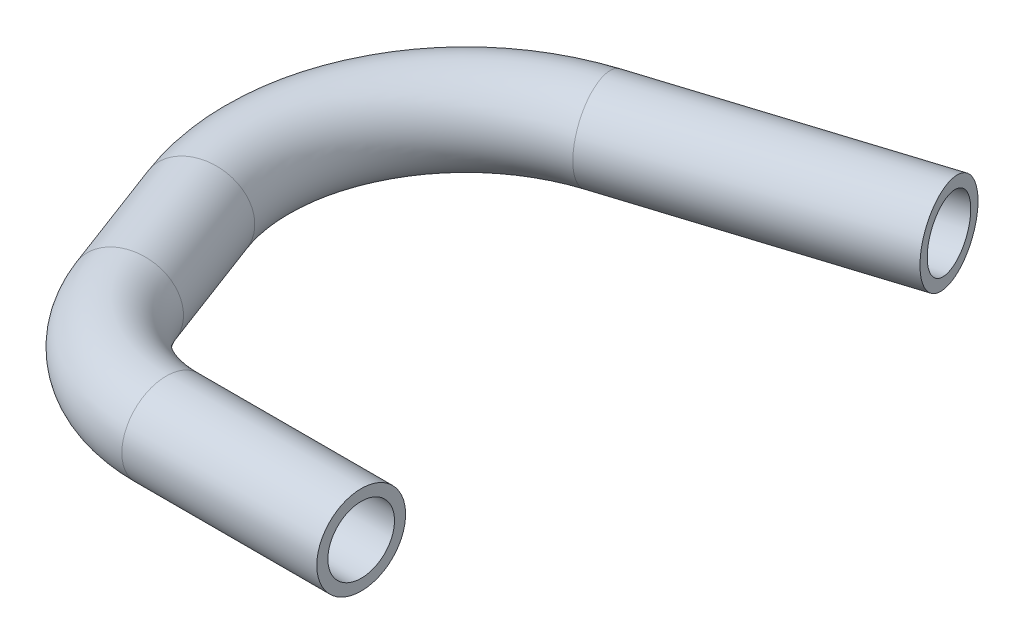
ISO-10303-21;
HEADER;
FILE_DESCRIPTION(('STEP AP214'),'2;1');
FILE_NAME('part.step','',(''),(''),'','','');
FILE_SCHEMA(('AUTOMOTIVE_DESIGN { 1 0 10303 214 1 1 1 1 }'));
ENDSEC;
DATA;
#1=APPLICATION_CONTEXT('core data for automotive mechanical design processes');
#2=APPLICATION_PROTOCOL_DEFINITION('international standard','automotive_design',2000,#1);
#3=PRODUCT_CONTEXT('',#1,'mechanical');
#4=PRODUCT('Part','Part','',(#3));
#5=PRODUCT_RELATED_PRODUCT_CATEGORY('part','',(#4));
#6=PRODUCT_DEFINITION_FORMATION('','',#4);
#7=PRODUCT_DEFINITION_CONTEXT('part definition',#1,'design');
#8=PRODUCT_DEFINITION('design','',#6,#7);
#9=PRODUCT_DEFINITION_SHAPE('','',#8);
#10=(LENGTH_UNIT() NAMED_UNIT(*) SI_UNIT(.MILLI.,.METRE.));
#11=(NAMED_UNIT(*) PLANE_ANGLE_UNIT() SI_UNIT($,.RADIAN.));
#12=(NAMED_UNIT(*) SI_UNIT($,.STERADIAN.) SOLID_ANGLE_UNIT());
#13=UNCERTAINTY_MEASURE_WITH_UNIT(LENGTH_MEASURE(1.E-05),#10,'distance_accuracy_value','');
#14=(GEOMETRIC_REPRESENTATION_CONTEXT(3) GLOBAL_UNCERTAINTY_ASSIGNED_CONTEXT((#13)) GLOBAL_UNIT_ASSIGNED_CONTEXT((#10,
#11,#12)) REPRESENTATION_CONTEXT('',''));
#15=CARTESIAN_POINT('',(0.,0.,0.));
#16=DIRECTION('',(0.,0.,1.));
#17=DIRECTION('',(1.,0.,0.));
#18=AXIS2_PLACEMENT_3D('',#15,#16,#17);
#19=CARTESIAN_POINT('',(0.,0.,0.));
#20=DIRECTION('',(-0.999999999999999,0.,0.));
#21=DIRECTION('',(0.,0.,1.));
#22=AXIS2_PLACEMENT_3D('',#19,#20,#21);
#23=CYLINDRICAL_SURFACE('',#22,16.);
#24=CARTESIAN_POINT('',(-70.1970105,0.,0.));
#25=DIRECTION('',(0.999999999999999,0.,0.));
#26=DIRECTION('',(0.,0.,-1.));
#27=AXIS2_PLACEMENT_3D('',#24,#25,#26);
#28=CIRCLE('',#27,16.);
#29=CARTESIAN_POINT('',(-70.1970105,0.,16.));
#30=VERTEX_POINT('',#29);
#31=EDGE_CURVE('E64',#30,#30,#28,.T.);
#32=CARTESIAN_POINT('',(0.,0.,0.));
#33=DIRECTION('',(0.999999999999999,0.,0.));
#34=DIRECTION('',(0.,0.,-1.));
#35=AXIS2_PLACEMENT_3D('',#32,#33,#34);
#36=CIRCLE('',#35,16.);
#37=CARTESIAN_POINT('',(0.,0.,16.));
#38=VERTEX_POINT('',#37);
#39=EDGE_CURVE('E61',#38,#38,#36,.T.);
#40=CARTESIAN_POINT('',(-70.1970105,0.,16.));
#41=CARTESIAN_POINT('',(-69.465791640625,0.,16.));
#42=CARTESIAN_POINT('',(-68.73457278125,0.,16.));
#43=CARTESIAN_POINT('',(-67.2721350625,0.,16.));
#44=CARTESIAN_POINT('',(-66.540916203125,0.,16.));
#45=CARTESIAN_POINT('',(-65.078478484375,0.,16.));
#46=CARTESIAN_POINT('',(-64.347259625,0.,16.));
#47=CARTESIAN_POINT('',(-62.88482190625,0.,16.));
#48=CARTESIAN_POINT('',(-62.153603046875,0.,16.));
#49=CARTESIAN_POINT('',(-60.691165328125,0.,16.));
#50=CARTESIAN_POINT('',(-59.95994646875,0.,16.));
#51=CARTESIAN_POINT('',(-58.49750875,0.,16.));
#52=CARTESIAN_POINT('',(-57.766289890625,0.,16.));
#53=CARTESIAN_POINT('',(-56.303852171875,0.,16.));
#54=CARTESIAN_POINT('',(-55.5726333125,0.,16.));
#55=CARTESIAN_POINT('',(-54.11019559375,0.,16.));
#56=CARTESIAN_POINT('',(-53.378976734375,0.,16.));
#57=CARTESIAN_POINT('',(-51.916539015625,0.,16.));
#58=CARTESIAN_POINT('',(-51.18532015625,0.,16.));
#59=CARTESIAN_POINT('',(-49.7228824375,0.,16.));
#60=CARTESIAN_POINT('',(-48.991663578125,0.,16.));
#61=CARTESIAN_POINT('',(-47.529225859375,0.,16.));
#62=CARTESIAN_POINT('',(-46.798007,0.,16.));
#63=CARTESIAN_POINT('',(-45.33556928125,0.,16.));
#64=CARTESIAN_POINT('',(-44.604350421875,0.,16.));
#65=CARTESIAN_POINT('',(-43.141912703125,0.,16.));
#66=CARTESIAN_POINT('',(-42.41069384375,0.,16.));
#67=CARTESIAN_POINT('',(-40.948256125,0.,16.));
#68=CARTESIAN_POINT('',(-40.217037265625,0.,16.));
#69=CARTESIAN_POINT('',(-38.754599546875,0.,16.));
#70=CARTESIAN_POINT('',(-38.0233806875,0.,16.));
#71=CARTESIAN_POINT('',(-36.56094296875,0.,16.));
#72=CARTESIAN_POINT('',(-35.829724109375,0.,16.));
#73=CARTESIAN_POINT('',(-34.367286390625,0.,16.));
#74=CARTESIAN_POINT('',(-33.63606753125,0.,16.));
#75=CARTESIAN_POINT('',(-32.1736298125,0.,16.));
#76=CARTESIAN_POINT('',(-31.442410953125,0.,16.));
#77=CARTESIAN_POINT('',(-29.979973234375,0.,16.));
#78=CARTESIAN_POINT('',(-29.248754375,0.,16.));
#79=CARTESIAN_POINT('',(-27.78631665625,0.,16.));
#80=CARTESIAN_POINT('',(-27.055097796875,0.,16.));
#81=CARTESIAN_POINT('',(-25.592660078125,0.,16.));
#82=CARTESIAN_POINT('',(-24.86144121875,0.,16.));
#83=CARTESIAN_POINT('',(-23.3990035,0.,16.));
#84=CARTESIAN_POINT('',(-22.667784640625,0.,16.));
#85=CARTESIAN_POINT('',(-21.205346921875,0.,16.));
#86=CARTESIAN_POINT('',(-20.4741280625,0.,16.));
#87=CARTESIAN_POINT('',(-19.01169034375,0.,16.));
#88=CARTESIAN_POINT('',(-18.280471484375,0.,16.));
#89=CARTESIAN_POINT('',(-16.818033765625,0.,16.));
#90=CARTESIAN_POINT('',(-16.08681490625,0.,16.));
#91=CARTESIAN_POINT('',(-14.6243771875,0.,16.));
#92=CARTESIAN_POINT('',(-13.893158328125,0.,16.));
#93=CARTESIAN_POINT('',(-12.430720609375,0.,16.));
#94=CARTESIAN_POINT('',(-11.69950175,0.,16.));
#95=CARTESIAN_POINT('',(-10.23706403125,0.,16.));
#96=CARTESIAN_POINT('',(-9.505845171875,0.,16.));
#97=CARTESIAN_POINT('',(-8.04340745312501,0.,16.));
#98=CARTESIAN_POINT('',(-7.31218859375001,0.,16.));
#99=CARTESIAN_POINT('',(-5.84975087500001,0.,16.));
#100=CARTESIAN_POINT('',(-5.11853201562501,0.,16.));
#101=CARTESIAN_POINT('',(-3.65609429687501,0.,16.));
#102=CARTESIAN_POINT('',(-2.92487543750001,0.,16.));
#103=CARTESIAN_POINT('',(-1.46243771875001,0.,16.));
#104=CARTESIAN_POINT('',(-0.731218859375008,0.,16.));
#105=CARTESIAN_POINT('',(0.,0.,16.));
#106=B_SPLINE_CURVE_WITH_KNOTS('',3,(#40,#41,#42,#43,#44,#45,#46,#47,#48,#49,#50,#51,#52,#53,
#54,#55,#56,#57,#58,#59,#60,#61,#62,#63,#64,#65,#66,#67,#68,#69,#70,#71,#72,#73,#74,#75,#76,#77,
#78,#79,#80,#81,#82,#83,#84,#85,#86,#87,#88,#89,#90,#91,#92,#93,#94,#95,#96,#97,#98,#99,#100,
#101,#102,#103,#104,#105),.UNSPECIFIED.,.F.,.F.,(4,2,2,2,2,2,2,2,2,2,2,2,2,2,2,2,2,2,2,2,2,2,2,
2,2,2,2,2,2,2,2,2,4),(0.,2.19365657812501,4.38731315625,6.58096973437501,8.77462631250001,
10.968282890625,13.16193946875,15.355596046875,17.549252625,19.742909203125,21.93656578125,
24.130222359375,26.3238789375,28.517535515625,30.71119209375,32.904848671875,35.09850525,
37.292161828125,39.48581840625,41.679474984375,43.8731315625,46.066788140625,48.26044471875,
50.454101296875,52.647757875,54.841414453125,57.03507103125,59.228727609375,61.4223841875,
63.616040765625,65.80969734375,68.003353921875,70.1970105),.UNSPECIFIED.);
#107=EDGE_CURVE('BSEAM40',#30,#38,#106,.T.);
#108=ORIENTED_EDGE('',*,*,#31,.T.);
#109=ORIENTED_EDGE('',*,*,#39,.F.);
#110=ORIENTED_EDGE('',*,*,#107,.T.);
#111=ORIENTED_EDGE('',*,*,#107,.F.);
#112=EDGE_LOOP('',(#108,#110,#109,#111));
#113=FACE_BOUND('',#112,.T.);
#114=ADVANCED_FACE('F40',(#113),#23,.T.);
#115=CARTESIAN_POINT('',(-70.1970105,0.,-50.));
#116=DIRECTION('',(0.,-1.,0.));
#117=DIRECTION('',(0.,0.,-1.));
#118=AXIS2_PLACEMENT_3D('',#115,#116,#117);
#119=TOROIDAL_SURFACE('',#118,50.,16.);
#120=CARTESIAN_POINT('',(-116.992532349691,0.,-32.3880967861184));
#121=DIRECTION('',(0.352238064277631,0.,0.935910436993812));
#122=DIRECTION('',(0.935910436993811,0.,-0.352238064277631));
#123=AXIS2_PLACEMENT_3D('',#120,#121,#122);
#124=CIRCLE('',#123,16.);
#125=CARTESIAN_POINT('',(-131.967099341592,0.,-26.7522877576763));
#126=VERTEX_POINT('',#125);
#127=EDGE_CURVE('E67',#126,#126,#124,.T.);
#128=CARTESIAN_POINT('',(-70.1970105,0.,-50.));
#129=DIRECTION('',(0.,-1.,0.));
#130=DIRECTION('',(0.,0.,-1.));
#131=AXIS2_PLACEMENT_3D('',#128,#129,#130);
#132=CIRCLE('',#131,66.);
#133=EDGE_CURVE('',#30,#126,#132,.T.);
#134=ORIENTED_EDGE('',*,*,#31,.F.);
#135=ORIENTED_EDGE('',*,*,#127,.T.);
#136=ORIENTED_EDGE('',*,*,#133,.T.);
#137=ORIENTED_EDGE('',*,*,#133,.F.);
#138=EDGE_LOOP('',(#134,#136,#135,#137));
#139=FACE_BOUND('',#138,.T.);
#140=ADVANCED_FACE('F109',(#139),#119,.T.);
#141=CARTESIAN_POINT('',(-116.99253234969,0.,-32.3880967861184));
#142=DIRECTION('',(-0.352238064277632,0.,-0.935910436993811));
#143=DIRECTION('',(-0.935910436993811,0.,0.352238064277632));
#144=AXIS2_PLACEMENT_3D('',#141,#142,#143);
#145=CYLINDRICAL_SURFACE('',#144,16.);
#146=CARTESIAN_POINT('',(-132.496272122416,0.,-73.5821451791775));
#147=DIRECTION('',(0.352238064277631,0.,0.935910436993811));
#148=DIRECTION('',(0.935910436993811,0.,-0.352238064277631));
#149=AXIS2_PLACEMENT_3D('',#146,#147,#148);
#150=CIRCLE('',#149,16.);
#151=CARTESIAN_POINT('',(-147.470839114317,0.,-67.9463361507354));
#152=VERTEX_POINT('',#151);
#153=EDGE_CURVE('E69',#152,#152,#150,.T.);
#154=ORIENTED_EDGE('',*,*,#153,.T.);
#155=EDGE_LOOP('',(#154));
#156=FACE_BOUND('',#155,.T.);
#157=ORIENTED_EDGE('',*,*,#127,.F.);
#158=EDGE_LOOP('',(#157));
#159=FACE_BOUND('',#158,.T.);
#160=ADVANCED_FACE('F89',(#156,#159),#145,.T.);
#161=CARTESIAN_POINT('',(-62.3029893478804,0.,-99.9999999999999));
#162=DIRECTION('',(0.,-1.,0.));
#163=DIRECTION('',(0.,0.,-1.));
#164=AXIS2_PLACEMENT_3D('',#161,#162,#163);
#165=TOROIDAL_SURFACE('',#164,75.,16.);
#166=CARTESIAN_POINT('',(-84.8559243107008,0.,-171.528771306117));
#167=DIRECTION('',(-0.953716950748227,0.,0.30070579950427));
#168=DIRECTION('',(0.30070579950427,0.,0.953716950748228));
#169=AXIS2_PLACEMENT_3D('',#166,#167,#168);
#170=CIRCLE('',#169,16.);
#171=CARTESIAN_POINT('',(-89.6672171027691,0.,-186.788242518089));
#172=VERTEX_POINT('',#171);
#173=EDGE_CURVE('E44',#172,#172,#170,.T.);
#174=CARTESIAN_POINT('',(-62.3029893478804,0.,-99.9999999999999));
#175=DIRECTION('',(0.,-1.,0.));
#176=DIRECTION('',(0.,0.,-1.));
#177=AXIS2_PLACEMENT_3D('',#174,#175,#176);
#178=CIRCLE('',#177,91.);
#179=EDGE_CURVE('',#152,#172,#178,.T.);
#180=ORIENTED_EDGE('',*,*,#153,.F.);
#181=ORIENTED_EDGE('',*,*,#173,.T.);
#182=ORIENTED_EDGE('',*,*,#179,.T.);
#183=ORIENTED_EDGE('',*,*,#179,.F.);
#184=EDGE_LOOP('',(#180,#182,#181,#183));
#185=FACE_BOUND('',#184,.T.);
#186=ADVANCED_FACE('F76',(#185),#165,.T.);
#187=CARTESIAN_POINT('',(-84.8559243107008,0.,-171.528771306117));
#188=DIRECTION('',(0.953716950748226,0.,-0.300705799504272));
#189=DIRECTION('',(-0.300705799504272,0.,-0.953716950748227));
#190=AXIS2_PLACEMENT_3D('',#187,#188,#189);
#191=CYLINDRICAL_SURFACE('',#190,16.);
#192=CARTESIAN_POINT('',(10.1970106521194,0.,-201.498846579287));
#193=DIRECTION('',(-0.953716950748226,0.,0.300705799504272));
#194=DIRECTION('',(0.300705799504272,0.,0.953716950748227));
#195=AXIS2_PLACEMENT_3D('',#192,#193,#194);
#196=CIRCLE('',#195,16.);
#197=CARTESIAN_POINT('',(5.38571786005106,0.,-216.758317791259));
#198=VERTEX_POINT('',#197);
#199=EDGE_CURVE('E57',#198,#198,#196,.T.);
#200=CARTESIAN_POINT('',(5.38571786005106,0.,-216.758317791259));
#201=CARTESIAN_POINT('',(4.39558312085502,0.,-216.446129507163));
#202=CARTESIAN_POINT('',(3.40544838165897,0.,-216.133941223068));
#203=CARTESIAN_POINT('',(1.42517890326687,0.,-215.509564654877));
#204=CARTESIAN_POINT('',(0.435044164070824,0.,-215.197376370781));
#205=CARTESIAN_POINT('',(-1.54522531432126,0.,-214.57299980259));
#206=CARTESIAN_POINT('',(-2.53536005351729,0.,-214.260811518494));
#207=CARTESIAN_POINT('',(-4.51562953190937,0.,-213.636434950303));
#208=CARTESIAN_POINT('',(-5.50576427110542,0.,-213.324246666208));
#209=CARTESIAN_POINT('',(-7.48603374949751,0.,-212.699870098017));
#210=CARTESIAN_POINT('',(-8.47616848869356,0.,-212.387681813921));
#211=CARTESIAN_POINT('',(-10.4564379670856,0.,-211.76330524573));
#212=CARTESIAN_POINT('',(-11.4465727062817,0.,-211.451116961635));
#213=CARTESIAN_POINT('',(-13.4268421846738,0.,-210.826740393444));
#214=CARTESIAN_POINT('',(-14.4169769238698,0.,-210.514552109348));
#215=CARTESIAN_POINT('',(-16.3972464022619,0.,-209.890175541157));
#216=CARTESIAN_POINT('',(-17.387381141458,0.,-209.577987257062));
#217=CARTESIAN_POINT('',(-19.36765061985,0.,-208.953610688871));
#218=CARTESIAN_POINT('',(-20.3577853590461,0.,-208.641422404775));
#219=CARTESIAN_POINT('',(-22.3380548374382,0.,-208.017045836584));
#220=CARTESIAN_POINT('',(-23.3281895766342,0.,-207.704857552489));
#221=CARTESIAN_POINT('',(-25.3084590550263,0.,-207.080480984297));
#222=CARTESIAN_POINT('',(-26.2985937942223,0.,-206.768292700202));
#223=CARTESIAN_POINT('',(-28.2788632726144,0.,-206.143916132011));
#224=CARTESIAN_POINT('',(-29.2689980118105,0.,-205.831727847915));
#225=CARTESIAN_POINT('',(-31.2492674902025,0.,-205.207351279724));
#226=CARTESIAN_POINT('',(-32.2394022293986,0.,-204.895162995629));
#227=CARTESIAN_POINT('',(-34.2196717077907,0.,-204.270786427438));
#228=CARTESIAN_POINT('',(-35.2098064469867,0.,-203.958598143342));
#229=CARTESIAN_POINT('',(-37.1900759253788,0.,-203.334221575151));
#230=CARTESIAN_POINT('',(-38.1802106645749,0.,-203.022033291056));
#231=CARTESIAN_POINT('',(-40.1604801429669,0.,-202.397656722865));
#232=CARTESIAN_POINT('',(-41.150614882163,0.,-202.085468438769));
#233=CARTESIAN_POINT('',(-43.1308843605551,0.,-201.461091870578));
#234=CARTESIAN_POINT('',(-44.1210190997511,0.,-201.148903586483));
#235=CARTESIAN_POINT('',(-46.1012885781432,0.,-200.524527018292));
#236=CARTESIAN_POINT('',(-47.0914233173392,0.,-200.212338734196));
#237=CARTESIAN_POINT('',(-49.0716927957313,0.,-199.587962166005));
#238=CARTESIAN_POINT('',(-50.0618275349274,0.,-199.275773881909));
#239=CARTESIAN_POINT('',(-52.0420970133195,0.,-198.651397313718));
#240=CARTESIAN_POINT('',(-53.0322317525155,0.,-198.339209029623));
#241=CARTESIAN_POINT('',(-55.0125012309076,0.,-197.714832461432));
#242=CARTESIAN_POINT('',(-56.0026359701036,0.,-197.402644177336));
#243=CARTESIAN_POINT('',(-57.9829054484957,0.,-196.778267609145));
#244=CARTESIAN_POINT('',(-58.9730401876918,0.,-196.46607932505));
#245=CARTESIAN_POINT('',(-60.9533096660839,0.,-195.841702756859));
#246=CARTESIAN_POINT('',(-61.9434444052799,0.,-195.529514472763));
#247=CARTESIAN_POINT('',(-63.923713883672,0.,-194.905137904572));
#248=CARTESIAN_POINT('',(-64.913848622868,0.,-194.592949620477));
#249=CARTESIAN_POINT('',(-66.8941181012601,0.,-193.968573052286));
#250=CARTESIAN_POINT('',(-67.8842528404562,0.,-193.65638476819));
#251=CARTESIAN_POINT('',(-69.8645223188482,0.,-193.032008199999));
#252=CARTESIAN_POINT('',(-70.8546570580443,0.,-192.719819915904));
#253=CARTESIAN_POINT('',(-72.8349265364364,0.,-192.095443347713));
#254=CARTESIAN_POINT('',(-73.8250612756324,0.,-191.783255063617));
#255=CARTESIAN_POINT('',(-75.8053307540245,0.,-191.158878495426));
#256=CARTESIAN_POINT('',(-76.7954654932206,0.,-190.84669021133));
#257=CARTESIAN_POINT('',(-78.7757349716126,0.,-190.222313643139));
#258=CARTESIAN_POINT('',(-79.7658697108087,0.,-189.910125359044));
#259=CARTESIAN_POINT('',(-81.7461391892008,0.,-189.285748790853));
#260=CARTESIAN_POINT('',(-82.7362739283968,0.,-188.973560506757));
#261=CARTESIAN_POINT('',(-84.7165434067889,0.,-188.349183938566));
#262=CARTESIAN_POINT('',(-85.7066781459849,0.,-188.036995654471));
#263=CARTESIAN_POINT('',(-87.686947624377,0.,-187.41261908628));
#264=CARTESIAN_POINT('',(-88.6770823635731,0.,-187.100430802184));
#265=CARTESIAN_POINT('',(-89.6672171027691,0.,-186.788242518089));
#266=B_SPLINE_CURVE_WITH_KNOTS('',3,(#200,#201,#202,#203,#204,#205,#206,#207,#208,#209,#210,
#211,#212,#213,#214,#215,#216,#217,#218,#219,#220,#221,#222,#223,#224,#225,#226,#227,#228,#229,
#230,#231,#232,#233,#234,#235,#236,#237,#238,#239,#240,#241,#242,#243,#244,#245,#246,#247,#248,
#249,#250,#251,#252,#253,#254,#255,#256,#257,#258,#259,#260,#261,#262,#263,#264,#265),
.UNSPECIFIED.,.F.,.F.,(4,2,2,2,2,2,2,2,2,2,2,2,2,2,2,2,2,2,2,2,2,2,2,2,2,2,2,2,2,2,2,2,4),(0.,
3.11455533558227,6.22911067116453,9.34366600674677,12.458221342329,15.5727766779113,
18.6873320134935,21.8018873490758,24.9164426846581,28.0309980202403,31.1455533558226,
34.2601086914048,37.3746640269871,40.4892193625693,43.6037746981516,46.7183300337338,
49.8328853693161,52.9474407048984,56.0619960404806,59.1765513760629,62.2911067116451,
65.4056620472274,68.5202173828096,71.6347727183919,74.7493280539742,77.8638833895564,
80.9784387251387,84.0929940607209,87.2075493963032,90.3221047318855,93.4366600674677,
96.55121540305,99.6657707386322),.UNSPECIFIED.);
#267=EDGE_CURVE('BSEAM42',#198,#172,#266,.T.);
#268=ORIENTED_EDGE('',*,*,#199,.T.);
#269=ORIENTED_EDGE('',*,*,#173,.F.);
#270=ORIENTED_EDGE('',*,*,#267,.T.);
#271=ORIENTED_EDGE('',*,*,#267,.F.);
#272=EDGE_LOOP('',(#268,#270,#269,#271));
#273=FACE_BOUND('',#272,.T.);
#274=ADVANCED_FACE('F42',(#273),#191,.T.);
#275=CARTESIAN_POINT('',(0.,0.,0.));
#276=DIRECTION('',(0.999999999999999,0.,0.));
#277=DIRECTION('',(0.,0.,-1.));
#278=AXIS2_PLACEMENT_3D('',#275,#276,#277);
#279=PLANE('',#278);
#280=CARTESIAN_POINT('',(0.,0.,0.));
#281=DIRECTION('',(0.999999999999999,0.,0.));
#282=DIRECTION('',(0.,0.,-1.));
#283=AXIS2_PLACEMENT_3D('',#280,#281,#282);
#284=CIRCLE('',#283,12.);
#285=CARTESIAN_POINT('',(0.,0.,12.));
#286=VERTEX_POINT('',#285);
#287=EDGE_CURVE('E60',#286,#286,#284,.F.);
#288=ORIENTED_EDGE('',*,*,#287,.T.);
#289=EDGE_LOOP('',(#288));
#290=FACE_BOUND('',#289,.T.);
#291=ORIENTED_EDGE('',*,*,#39,.T.);
#292=EDGE_LOOP('',(#291));
#293=FACE_BOUND('',#292,.T.);
#294=ADVANCED_FACE('F80',(#290,#293),#279,.T.);
#295=CARTESIAN_POINT('',(10.1970106521194,0.,-201.498846579287));
#296=DIRECTION('',(-0.953716950748226,0.,0.300705799504272));
#297=DIRECTION('',(0.300705799504272,0.,0.953716950748227));
#298=AXIS2_PLACEMENT_3D('',#295,#296,#297);
#299=PLANE('',#298);
#300=CARTESIAN_POINT('',(10.1970106521194,0.,-201.498846579287));
#301=DIRECTION('',(-0.953716950748226,0.,0.300705799504272));
#302=DIRECTION('',(0.300705799504272,0.,0.953716950748227));
#303=AXIS2_PLACEMENT_3D('',#300,#301,#302);
#304=CIRCLE('',#303,12.);
#305=CARTESIAN_POINT('',(6.58854105806814,0.,-212.943449988266));
#306=VERTEX_POINT('',#305);
#307=EDGE_CURVE('E12',#306,#306,#304,.F.);
#308=ORIENTED_EDGE('',*,*,#307,.F.);
#309=EDGE_LOOP('',(#308));
#310=FACE_BOUND('',#309,.T.);
#311=ORIENTED_EDGE('',*,*,#199,.F.);
#312=EDGE_LOOP('',(#311));
#313=FACE_BOUND('',#312,.T.);
#314=ADVANCED_FACE('F86',(#310,#313),#299,.F.);
#315=CARTESIAN_POINT('',(0.,0.,0.));
#316=DIRECTION('',(-0.999999999999999,0.,0.));
#317=DIRECTION('',(0.,0.,1.));
#318=AXIS2_PLACEMENT_3D('',#315,#316,#317);
#319=CYLINDRICAL_SURFACE('',#318,12.);
#320=CARTESIAN_POINT('',(-70.1970105,0.,0.));
#321=DIRECTION('',(0.999999999999999,0.,0.));
#322=DIRECTION('',(0.,0.,-1.));
#323=AXIS2_PLACEMENT_3D('',#320,#321,#322);
#324=CIRCLE('',#323,12.);
#325=CARTESIAN_POINT('',(-70.1970105,0.,12.));
#326=VERTEX_POINT('',#325);
#327=EDGE_CURVE('E193',#326,#326,#324,.F.);
#328=CARTESIAN_POINT('',(-70.1970105,0.,12.));
#329=CARTESIAN_POINT('',(-69.465791640625,0.,12.));
#330=CARTESIAN_POINT('',(-68.73457278125,0.,12.));
#331=CARTESIAN_POINT('',(-67.2721350625,0.,12.));
#332=CARTESIAN_POINT('',(-66.540916203125,0.,12.));
#333=CARTESIAN_POINT('',(-65.078478484375,0.,12.));
#334=CARTESIAN_POINT('',(-64.347259625,0.,12.));
#335=CARTESIAN_POINT('',(-62.88482190625,0.,12.));
#336=CARTESIAN_POINT('',(-62.153603046875,0.,12.));
#337=CARTESIAN_POINT('',(-60.691165328125,0.,12.));
#338=CARTESIAN_POINT('',(-59.95994646875,0.,12.));
#339=CARTESIAN_POINT('',(-58.49750875,0.,12.));
#340=CARTESIAN_POINT('',(-57.766289890625,0.,12.));
#341=CARTESIAN_POINT('',(-56.303852171875,0.,12.));
#342=CARTESIAN_POINT('',(-55.5726333125,0.,12.));
#343=CARTESIAN_POINT('',(-54.11019559375,0.,12.));
#344=CARTESIAN_POINT('',(-53.378976734375,0.,12.));
#345=CARTESIAN_POINT('',(-51.916539015625,0.,12.));
#346=CARTESIAN_POINT('',(-51.18532015625,0.,12.));
#347=CARTESIAN_POINT('',(-49.7228824375,0.,12.));
#348=CARTESIAN_POINT('',(-48.991663578125,0.,12.));
#349=CARTESIAN_POINT('',(-47.529225859375,0.,12.));
#350=CARTESIAN_POINT('',(-46.798007,0.,12.));
#351=CARTESIAN_POINT('',(-45.33556928125,0.,12.));
#352=CARTESIAN_POINT('',(-44.604350421875,0.,12.));
#353=CARTESIAN_POINT('',(-43.141912703125,0.,12.));
#354=CARTESIAN_POINT('',(-42.41069384375,0.,12.));
#355=CARTESIAN_POINT('',(-40.948256125,0.,12.));
#356=CARTESIAN_POINT('',(-40.217037265625,0.,12.));
#357=CARTESIAN_POINT('',(-38.754599546875,0.,12.));
#358=CARTESIAN_POINT('',(-38.0233806875,0.,12.));
#359=CARTESIAN_POINT('',(-36.56094296875,0.,12.));
#360=CARTESIAN_POINT('',(-35.829724109375,0.,12.));
#361=CARTESIAN_POINT('',(-34.367286390625,0.,12.));
#362=CARTESIAN_POINT('',(-33.63606753125,0.,12.));
#363=CARTESIAN_POINT('',(-32.1736298125,0.,12.));
#364=CARTESIAN_POINT('',(-31.442410953125,0.,12.));
#365=CARTESIAN_POINT('',(-29.979973234375,0.,12.));
#366=CARTESIAN_POINT('',(-29.248754375,0.,12.));
#367=CARTESIAN_POINT('',(-27.78631665625,0.,12.));
#368=CARTESIAN_POINT('',(-27.055097796875,0.,12.));
#369=CARTESIAN_POINT('',(-25.592660078125,0.,12.));
#370=CARTESIAN_POINT('',(-24.86144121875,0.,12.));
#371=CARTESIAN_POINT('',(-23.3990035,0.,12.));
#372=CARTESIAN_POINT('',(-22.667784640625,0.,12.));
#373=CARTESIAN_POINT('',(-21.205346921875,0.,12.));
#374=CARTESIAN_POINT('',(-20.4741280625,0.,12.));
#375=CARTESIAN_POINT('',(-19.01169034375,0.,12.));
#376=CARTESIAN_POINT('',(-18.280471484375,0.,12.));
#377=CARTESIAN_POINT('',(-16.818033765625,0.,12.));
#378=CARTESIAN_POINT('',(-16.08681490625,0.,12.));
#379=CARTESIAN_POINT('',(-14.6243771875,0.,12.));
#380=CARTESIAN_POINT('',(-13.893158328125,0.,12.));
#381=CARTESIAN_POINT('',(-12.430720609375,0.,12.));
#382=CARTESIAN_POINT('',(-11.69950175,0.,12.));
#383=CARTESIAN_POINT('',(-10.23706403125,0.,12.));
#384=CARTESIAN_POINT('',(-9.505845171875,0.,12.));
#385=CARTESIAN_POINT('',(-8.043407453125,0.,12.));
#386=CARTESIAN_POINT('',(-7.31218859375,0.,12.));
#387=CARTESIAN_POINT('',(-5.849750875,0.,12.));
#388=CARTESIAN_POINT('',(-5.118532015625,0.,12.));
#389=CARTESIAN_POINT('',(-3.656094296875,0.,12.));
#390=CARTESIAN_POINT('',(-2.9248754375,0.,12.));
#391=CARTESIAN_POINT('',(-1.46243771875,0.,12.));
#392=CARTESIAN_POINT('',(-0.731218859374996,0.,12.));
#393=CARTESIAN_POINT('',(0.,0.,12.));
#394=B_SPLINE_CURVE_WITH_KNOTS('',3,(#328,#329,#330,#331,#332,#333,#334,#335,#336,#337,#338,
#339,#340,#341,#342,#343,#344,#345,#346,#347,#348,#349,#350,#351,#352,#353,#354,#355,#356,#357,
#358,#359,#360,#361,#362,#363,#364,#365,#366,#367,#368,#369,#370,#371,#372,#373,#374,#375,#376,
#377,#378,#379,#380,#381,#382,#383,#384,#385,#386,#387,#388,#389,#390,#391,#392,#393),
.UNSPECIFIED.,.F.,.F.,(4,2,2,2,2,2,2,2,2,2,2,2,2,2,2,2,2,2,2,2,2,2,2,2,2,2,2,2,2,2,2,2,4),(0.,
2.19365657812501,4.38731315625,6.58096973437501,8.77462631250001,10.968282890625,13.16193946875,
15.355596046875,17.549252625,19.742909203125,21.93656578125,24.130222359375,26.3238789375,
28.517535515625,30.71119209375,32.904848671875,35.09850525,37.292161828125,39.48581840625,
41.679474984375,43.8731315625,46.066788140625,48.26044471875,50.454101296875,52.647757875,
54.841414453125,57.03507103125,59.228727609375,61.4223841875,63.616040765625,65.80969734375,
68.003353921875,70.1970105),.UNSPECIFIED.);
#395=EDGE_CURVE('BSEAM104',#326,#286,#394,.T.);
#396=ORIENTED_EDGE('',*,*,#327,.T.);
#397=ORIENTED_EDGE('',*,*,#287,.F.);
#398=ORIENTED_EDGE('',*,*,#395,.T.);
#399=ORIENTED_EDGE('',*,*,#395,.F.);
#400=EDGE_LOOP('',(#396,#398,#397,#399));
#401=FACE_BOUND('',#400,.T.);
#402=ADVANCED_FACE('F104',(#401),#319,.F.);
#403=CARTESIAN_POINT('',(-70.1970105,0.,-50.));
#404=DIRECTION('',(0.,-1.,0.));
#405=DIRECTION('',(0.,0.,-1.));
#406=AXIS2_PLACEMENT_3D('',#403,#404,#405);
#407=TOROIDAL_SURFACE('',#406,50.,12.);
#408=CARTESIAN_POINT('',(-116.992532349691,0.,-32.3880967861184));
#409=DIRECTION('',(0.352238064277631,0.,0.935910436993812));
#410=DIRECTION('',(0.935910436993811,0.,-0.352238064277631));
#411=AXIS2_PLACEMENT_3D('',#408,#409,#410);
#412=CIRCLE('',#411,12.);
#413=CARTESIAN_POINT('',(-128.223457593616,0.,-28.1612400147868));
#414=VERTEX_POINT('',#413);
#415=EDGE_CURVE('E192',#414,#414,#412,.F.);
#416=CARTESIAN_POINT('',(-70.1970105,0.,-50.));
#417=DIRECTION('',(0.,-1.,0.));
#418=DIRECTION('',(0.,0.,-1.));
#419=AXIS2_PLACEMENT_3D('',#416,#417,#418);
#420=CIRCLE('',#419,62.);
#421=EDGE_CURVE('',#326,#414,#420,.T.);
#422=ORIENTED_EDGE('',*,*,#327,.F.);
#423=ORIENTED_EDGE('',*,*,#415,.T.);
#424=ORIENTED_EDGE('',*,*,#421,.T.);
#425=ORIENTED_EDGE('',*,*,#421,.F.);
#426=EDGE_LOOP('',(#422,#424,#423,#425));
#427=FACE_BOUND('',#426,.T.);
#428=ADVANCED_FACE('F155',(#427),#407,.F.);
#429=CARTESIAN_POINT('',(-116.99253234969,0.,-32.3880967861184));
#430=DIRECTION('',(-0.352238064277632,0.,-0.935910436993811));
#431=DIRECTION('',(-0.935910436993811,0.,0.352238064277632));
#432=AXIS2_PLACEMENT_3D('',#429,#430,#431);
#433=CYLINDRICAL_SURFACE('',#432,12.);
#434=CARTESIAN_POINT('',(-132.496272122416,0.,-73.5821451791775));
#435=DIRECTION('',(0.352238064277631,0.,0.935910436993811));
#436=DIRECTION('',(0.935910436993811,0.,-0.352238064277631));
#437=AXIS2_PLACEMENT_3D('',#434,#435,#436);
#438=CIRCLE('',#437,12.);
#439=CARTESIAN_POINT('',(-143.727197366342,0.,-69.3552884078459));
#440=VERTEX_POINT('',#439);
#441=EDGE_CURVE('E53',#440,#440,#438,.F.);
#442=ORIENTED_EDGE('',*,*,#441,.T.);
#443=EDGE_LOOP('',(#442));
#444=FACE_BOUND('',#443,.T.);
#445=ORIENTED_EDGE('',*,*,#415,.F.);
#446=EDGE_LOOP('',(#445));
#447=FACE_BOUND('',#446,.T.);
#448=ADVANCED_FACE('F97',(#444,#447),#433,.F.);
#449=CARTESIAN_POINT('',(-62.3029893478804,0.,-99.9999999999999));
#450=DIRECTION('',(0.,-1.,0.));
#451=DIRECTION('',(0.,0.,-1.));
#452=AXIS2_PLACEMENT_3D('',#449,#450,#451);
#453=TOROIDAL_SURFACE('',#452,75.,12.);
#454=CARTESIAN_POINT('',(-84.8559243107008,0.,-171.528771306117));
#455=DIRECTION('',(-0.953716950748227,0.,0.30070579950427));
#456=DIRECTION('',(0.30070579950427,0.,0.953716950748228));
#457=AXIS2_PLACEMENT_3D('',#454,#455,#456);
#458=CIRCLE('',#457,12.);
#459=CARTESIAN_POINT('',(-88.4643939047521,0.,-182.973374715096));
#460=VERTEX_POINT('',#459);
#461=EDGE_CURVE('E48',#460,#460,#458,.F.);
#462=CARTESIAN_POINT('',(-62.3029893478804,0.,-99.9999999999999));
#463=DIRECTION('',(0.,-1.,0.));
#464=DIRECTION('',(0.,0.,-1.));
#465=AXIS2_PLACEMENT_3D('',#462,#463,#464);
#466=CIRCLE('',#465,87.);
#467=EDGE_CURVE('',#440,#460,#466,.T.);
#468=ORIENTED_EDGE('',*,*,#441,.F.);
#469=ORIENTED_EDGE('',*,*,#461,.T.);
#470=ORIENTED_EDGE('',*,*,#467,.T.);
#471=ORIENTED_EDGE('',*,*,#467,.F.);
#472=EDGE_LOOP('',(#468,#470,#469,#471));
#473=FACE_BOUND('',#472,.T.);
#474=ADVANCED_FACE('F92',(#473),#453,.F.);
#475=CARTESIAN_POINT('',(-84.8559243107008,0.,-171.528771306117));
#476=DIRECTION('',(0.953716950748226,0.,-0.300705799504272));
#477=DIRECTION('',(-0.300705799504272,0.,-0.953716950748227));
#478=AXIS2_PLACEMENT_3D('',#475,#476,#477);
#479=CYLINDRICAL_SURFACE('',#478,12.);
#480=CARTESIAN_POINT('',(6.58854105806814,0.,-212.943449988266));
#481=CARTESIAN_POINT('',(5.5984063188721,0.,-212.63126170417));
#482=CARTESIAN_POINT('',(4.60827157967605,0.,-212.319073420075));
#483=CARTESIAN_POINT('',(2.62800210128395,0.,-211.694696851884));
#484=CARTESIAN_POINT('',(1.6378673620879,0.,-211.382508567788));
#485=CARTESIAN_POINT('',(-0.342402116304177,0.,-210.758131999597));
#486=CARTESIAN_POINT('',(-1.33253685550021,0.,-210.445943715502));
#487=CARTESIAN_POINT('',(-3.31280633389229,0.,-209.821567147311));
#488=CARTESIAN_POINT('',(-4.30294107308834,0.,-209.509378863215));
#489=CARTESIAN_POINT('',(-6.28321055148043,0.,-208.885002295024));
#490=CARTESIAN_POINT('',(-7.27334529067648,0.,-208.572814010928));
#491=CARTESIAN_POINT('',(-9.25361476906856,0.,-207.948437442737));
#492=CARTESIAN_POINT('',(-10.2437495082646,0.,-207.636249158642));
#493=CARTESIAN_POINT('',(-12.2240189866567,0.,-207.011872590451));
#494=CARTESIAN_POINT('',(-13.2141537258527,0.,-206.699684306355));
#495=CARTESIAN_POINT('',(-15.1944232042448,0.,-206.075307738164));
#496=CARTESIAN_POINT('',(-16.1845579434409,0.,-205.763119454069));
#497=CARTESIAN_POINT('',(-18.164827421833,0.,-205.138742885878));
#498=CARTESIAN_POINT('',(-19.154962161029,0.,-204.826554601782));
#499=CARTESIAN_POINT('',(-21.1352316394211,0.,-204.202178033591));
#500=CARTESIAN_POINT('',(-22.1253663786171,0.,-203.889989749496));
#501=CARTESIAN_POINT('',(-24.1056358570092,0.,-203.265613181305));
#502=CARTESIAN_POINT('',(-25.0957705962053,0.,-202.953424897209));
#503=CARTESIAN_POINT('',(-27.0760400745973,0.,-202.329048329018));
#504=CARTESIAN_POINT('',(-28.0661748137934,0.,-202.016860044923));
#505=CARTESIAN_POINT('',(-30.0464442921855,0.,-201.392483476731));
#506=CARTESIAN_POINT('',(-31.0365790313815,0.,-201.080295192636));
#507=CARTESIAN_POINT('',(-33.0168485097736,0.,-200.455918624445));
#508=CARTESIAN_POINT('',(-34.0069832489696,0.,-200.143730340349));
#509=CARTESIAN_POINT('',(-35.9872527273617,0.,-199.519353772158));
#510=CARTESIAN_POINT('',(-36.9773874665578,0.,-199.207165488063));
#511=CARTESIAN_POINT('',(-38.9576569449499,0.,-198.582788919872));
#512=CARTESIAN_POINT('',(-39.9477916841459,0.,-198.270600635776));
#513=CARTESIAN_POINT('',(-41.928061162538,0.,-197.646224067585));
#514=CARTESIAN_POINT('',(-42.918195901734,0.,-197.33403578349));
#515=CARTESIAN_POINT('',(-44.8984653801261,0.,-196.709659215299));
#516=CARTESIAN_POINT('',(-45.8886001193222,0.,-196.397470931203));
#517=CARTESIAN_POINT('',(-47.8688695977143,0.,-195.773094363012));
#518=CARTESIAN_POINT('',(-48.8590043369103,0.,-195.460906078917));
#519=CARTESIAN_POINT('',(-50.8392738153024,0.,-194.836529510726));
#520=CARTESIAN_POINT('',(-51.8294085544984,0.,-194.52434122663));
#521=CARTESIAN_POINT('',(-53.8096780328905,0.,-193.899964658439));
#522=CARTESIAN_POINT('',(-54.7998127720866,0.,-193.587776374343));
#523=CARTESIAN_POINT('',(-56.7800822504786,0.,-192.963399806152));
#524=CARTESIAN_POINT('',(-57.7702169896747,0.,-192.651211522057));
#525=CARTESIAN_POINT('',(-59.7504864680668,0.,-192.026834953866));
#526=CARTESIAN_POINT('',(-60.7406212072628,0.,-191.71464666977));
#527=CARTESIAN_POINT('',(-62.7208906856549,0.,-191.090270101579));
#528=CARTESIAN_POINT('',(-63.711025424851,0.,-190.778081817484));
#529=CARTESIAN_POINT('',(-65.691294903243,0.,-190.153705249293));
#530=CARTESIAN_POINT('',(-66.6814296424391,0.,-189.841516965197));
#531=CARTESIAN_POINT('',(-68.6616991208312,0.,-189.217140397006));
#532=CARTESIAN_POINT('',(-69.6518338600272,0.,-188.904952112911));
#533=CARTESIAN_POINT('',(-71.6321033384193,0.,-188.28057554472));
#534=CARTESIAN_POINT('',(-72.6222380776153,0.,-187.968387260624));
#535=CARTESIAN_POINT('',(-74.6025075560074,0.,-187.344010692433));
#536=CARTESIAN_POINT('',(-75.5926422952035,0.,-187.031822408338));
#537=CARTESIAN_POINT('',(-77.5729117735956,0.,-186.407445840147));
#538=CARTESIAN_POINT('',(-78.5630465127916,0.,-186.095257556051));
#539=CARTESIAN_POINT('',(-80.5433159911837,0.,-185.47088098786));
#540=CARTESIAN_POINT('',(-81.5334507303797,0.,-185.158692703764));
#541=CARTESIAN_POINT('',(-83.5137202087718,0.,-184.534316135573));
#542=CARTESIAN_POINT('',(-84.5038549479679,0.,-184.222127851478));
#543=CARTESIAN_POINT('',(-86.48412442636,0.,-183.597751283287));
#544=CARTESIAN_POINT('',(-87.474259165556,0.,-183.285562999191));
#545=CARTESIAN_POINT('',(-88.464393904752,0.,-182.973374715096));
#546=B_SPLINE_CURVE_WITH_KNOTS('',3,(#480,#481,#482,#483,#484,#485,#486,#487,#488,#489,#490,
#491,#492,#493,#494,#495,#496,#497,#498,#499,#500,#501,#502,#503,#504,#505,#506,#507,#508,#509,
#510,#511,#512,#513,#514,#515,#516,#517,#518,#519,#520,#521,#522,#523,#524,#525,#526,#527,#528,
#529,#530,#531,#532,#533,#534,#535,#536,#537,#538,#539,#540,#541,#542,#543,#544,#545),
.UNSPECIFIED.,.F.,.F.,(4,2,2,2,2,2,2,2,2,2,2,2,2,2,2,2,2,2,2,2,2,2,2,2,2,2,2,2,2,2,2,2,4),(0.,
3.11455533558227,6.22911067116453,9.34366600674677,12.458221342329,15.5727766779113,
18.6873320134935,21.8018873490758,24.9164426846581,28.0309980202403,31.1455533558226,
34.2601086914048,37.3746640269871,40.4892193625693,43.6037746981516,46.7183300337338,
49.8328853693161,52.9474407048984,56.0619960404806,59.1765513760629,62.2911067116451,
65.4056620472274,68.5202173828096,71.6347727183919,74.7493280539742,77.8638833895564,
80.9784387251387,84.0929940607209,87.2075493963032,90.3221047318854,93.4366600674677,
96.5512154030499,99.6657707386322),.UNSPECIFIED.);
#547=EDGE_CURVE('BSEAM90',#306,#460,#546,.T.);
#548=ORIENTED_EDGE('',*,*,#307,.T.);
#549=ORIENTED_EDGE('',*,*,#461,.F.);
#550=ORIENTED_EDGE('',*,*,#547,.T.);
#551=ORIENTED_EDGE('',*,*,#547,.F.);
#552=EDGE_LOOP('',(#548,#550,#549,#551));
#553=FACE_BOUND('',#552,.T.);
#554=ADVANCED_FACE('F90',(#553),#479,.F.);
#555=CLOSED_SHELL('',(#114,#140,#160,#186,#274,#294,#314,#402,#428,#448,#474,#554));
#556=MANIFOLD_SOLID_BREP('B2',#555);
#557=ADVANCED_BREP_SHAPE_REPRESENTATION('',(#18,#556),#14);
#558=SHAPE_DEFINITION_REPRESENTATION(#9,#557);
ENDSEC;
END-ISO-10303-21;
